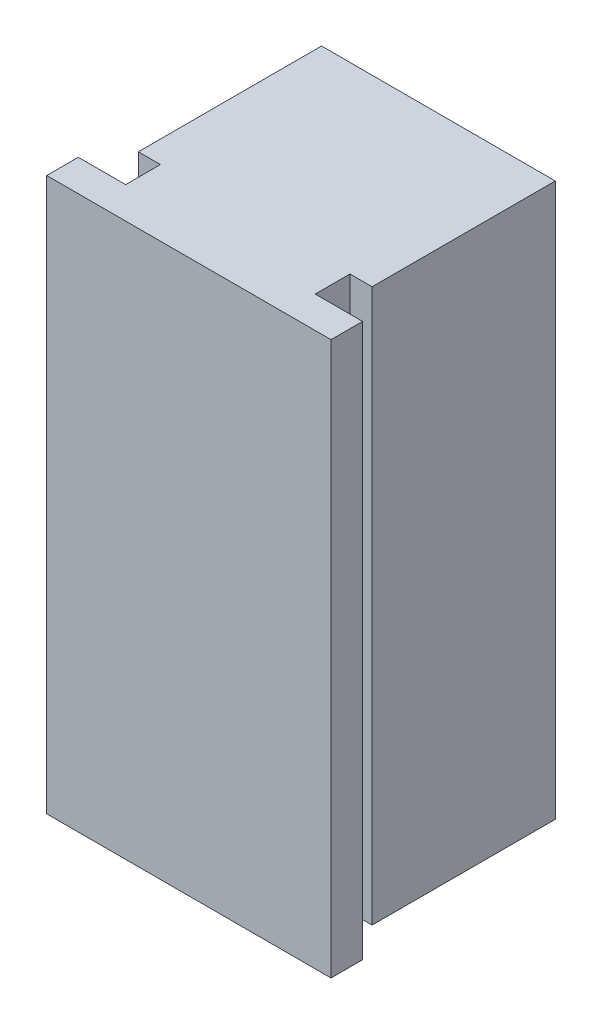
ISO-10303-21;
HEADER;
FILE_DESCRIPTION(('STEP AP214'),'2;1');
FILE_NAME('part.step','',(''),(''),'','','');
FILE_SCHEMA(('AUTOMOTIVE_DESIGN { 1 0 10303 214 1 1 1 1 }'));
ENDSEC;
DATA;
#1=APPLICATION_CONTEXT('core data for automotive mechanical design processes');
#2=APPLICATION_PROTOCOL_DEFINITION('international standard','automotive_design',2000,#1);
#3=PRODUCT_CONTEXT('',#1,'mechanical');
#4=PRODUCT('Part','Part','',(#3));
#5=PRODUCT_RELATED_PRODUCT_CATEGORY('part','',(#4));
#6=PRODUCT_DEFINITION_FORMATION('','',#4);
#7=PRODUCT_DEFINITION_CONTEXT('part definition',#1,'design');
#8=PRODUCT_DEFINITION('design','',#6,#7);
#9=PRODUCT_DEFINITION_SHAPE('','',#8);
#10=(LENGTH_UNIT() NAMED_UNIT(*) SI_UNIT(.MILLI.,.METRE.));
#11=(NAMED_UNIT(*) PLANE_ANGLE_UNIT() SI_UNIT($,.RADIAN.));
#12=(NAMED_UNIT(*) SI_UNIT($,.STERADIAN.) SOLID_ANGLE_UNIT());
#13=UNCERTAINTY_MEASURE_WITH_UNIT(LENGTH_MEASURE(1.E-05),#10,'distance_accuracy_value','');
#14=(GEOMETRIC_REPRESENTATION_CONTEXT(3) GLOBAL_UNCERTAINTY_ASSIGNED_CONTEXT((#13)) GLOBAL_UNIT_ASSIGNED_CONTEXT((#10,
#11,#12)) REPRESENTATION_CONTEXT('',''));
#15=CARTESIAN_POINT('',(0.,0.,0.));
#16=DIRECTION('',(0.,0.,1.));
#17=DIRECTION('',(1.,0.,0.));
#18=AXIS2_PLACEMENT_3D('',#15,#16,#17);
#19=CARTESIAN_POINT('',(0.,35.,3.36129032258062));
#20=DIRECTION('',(0.,0.,-1.));
#21=DIRECTION('',(-1.,0.,0.));
#22=AXIS2_PLACEMENT_3D('',#19,#20,#21);
#23=PLANE('',#22);
#24=CARTESIAN_POINT('',(8.9354838709677,17.5,3.36129032258062));
#25=DIRECTION('',(0.,0.,-1.));
#26=DIRECTION('',(-1.,0.,0.));
#27=AXIS2_PLACEMENT_3D('',#24,#25,#26);
#28=CIRCLE('',#27,4.5);
#29=CARTESIAN_POINT('',(4.4354838709677,17.5,3.36129032258062));
#30=VERTEX_POINT('',#29);
#31=EDGE_CURVE('E253',#30,#30,#28,.T.);
#32=ORIENTED_EDGE('',*,*,#31,.F.);
#33=EDGE_LOOP('',(#32));
#34=FACE_BOUND('',#33,.T.);
#35=DIRECTION('',(1.,0.,0.));
#36=VECTOR('',#35,1.);
#37=CARTESIAN_POINT('',(0.,0.,3.36129032258062));
#38=LINE('',#37,#36);
#39=CARTESIAN_POINT('',(1.5354838709677,0.,3.36129032258062));
#40=VERTEX_POINT('',#39);
#41=CARTESIAN_POINT('',(16.3354838709677,0.,3.36129032258061));
#42=VERTEX_POINT('',#41);
#43=EDGE_CURVE('E161',#40,#42,#38,.T.);
#44=ORIENTED_EDGE('',*,*,#43,.F.);
#45=DIRECTION('',(0.,-1.,0.));
#46=VECTOR('',#45,1.);
#47=CARTESIAN_POINT('',(1.5354838709677,35.,3.36129032258062));
#48=LINE('',#47,#46);
#49=CARTESIAN_POINT('',(1.5354838709677,35.,3.36129032258062));
#50=VERTEX_POINT('',#49);
#51=EDGE_CURVE('E11',#50,#40,#48,.T.);
#52=ORIENTED_EDGE('',*,*,#51,.F.);
#53=DIRECTION('',(1.,0.,0.));
#54=VECTOR('',#53,1.);
#55=CARTESIAN_POINT('',(0.,35.,3.36129032258062));
#56=LINE('',#55,#54);
#57=CARTESIAN_POINT('',(16.3354838709677,35.,3.36129032258061));
#58=VERTEX_POINT('',#57);
#59=EDGE_CURVE('E204',#50,#58,#56,.T.);
#60=ORIENTED_EDGE('',*,*,#59,.T.);
#61=DIRECTION('',(0.,-1.,0.));
#62=VECTOR('',#61,1.);
#63=CARTESIAN_POINT('',(16.3354838709677,35.,3.36129032258061));
#64=LINE('',#63,#62);
#65=EDGE_CURVE('E105',#58,#42,#64,.T.);
#66=ORIENTED_EDGE('',*,*,#65,.T.);
#67=EDGE_LOOP('',(#44,#52,#60,#66));
#68=FACE_BOUND('',#67,.T.);
#69=ADVANCED_FACE('F41',(#34,#68),#23,.T.);
#70=CARTESIAN_POINT('',(1.5354838709677,35.,0.));
#71=DIRECTION('',(-1.,0.,0.));
#72=DIRECTION('',(0.,0.,1.));
#73=AXIS2_PLACEMENT_3D('',#70,#71,#72);
#74=PLANE('',#73);
#75=DIRECTION('',(0.,0.,-1.));
#76=VECTOR('',#75,1.);
#77=CARTESIAN_POINT('',(1.5354838709677,0.,0.));
#78=LINE('',#77,#76);
#79=CARTESIAN_POINT('',(1.53548387096771,0.,14.9612903225806));
#80=VERTEX_POINT('',#79);
#81=EDGE_CURVE('E165',#80,#40,#78,.T.);
#82=ORIENTED_EDGE('',*,*,#81,.F.);
#83=DIRECTION('',(0.,-1.,0.));
#84=VECTOR('',#83,1.);
#85=CARTESIAN_POINT('',(1.53548387096771,35.,14.9612903225806));
#86=LINE('',#85,#84);
#87=CARTESIAN_POINT('',(1.53548387096771,35.,14.9612903225806));
#88=VERTEX_POINT('',#87);
#89=EDGE_CURVE('E50',#88,#80,#86,.T.);
#90=ORIENTED_EDGE('',*,*,#89,.F.);
#91=DIRECTION('',(0.,0.,-1.));
#92=VECTOR('',#91,1.);
#93=CARTESIAN_POINT('',(1.5354838709677,35.,0.));
#94=LINE('',#93,#92);
#95=EDGE_CURVE('E244',#88,#50,#94,.T.);
#96=ORIENTED_EDGE('',*,*,#95,.T.);
#97=ORIENTED_EDGE('',*,*,#51,.T.);
#98=EDGE_LOOP('',(#82,#90,#96,#97));
#99=FACE_BOUND('',#98,.T.);
#100=ADVANCED_FACE('F243',(#99),#74,.T.);
#101=CARTESIAN_POINT('',(0.,35.,14.9612903225806));
#102=DIRECTION('',(0.,0.,-1.));
#103=DIRECTION('',(-1.,0.,0.));
#104=AXIS2_PLACEMENT_3D('',#101,#102,#103);
#105=PLANE('',#104);
#106=DIRECTION('',(1.,0.,0.));
#107=VECTOR('',#106,1.);
#108=CARTESIAN_POINT('',(0.,0.,14.9612903225806));
#109=LINE('',#108,#107);
#110=CARTESIAN_POINT('',(2.9354838709677,0.,14.9612903225806));
#111=VERTEX_POINT('',#110);
#112=EDGE_CURVE('E170',#80,#111,#109,.T.);
#113=ORIENTED_EDGE('',*,*,#112,.T.);
#114=DIRECTION('',(0.,-1.,0.));
#115=VECTOR('',#114,1.);
#116=CARTESIAN_POINT('',(2.9354838709677,35.,14.9612903225806));
#117=LINE('',#116,#115);
#118=CARTESIAN_POINT('',(2.9354838709677,35.,14.9612903225806));
#119=VERTEX_POINT('',#118);
#120=EDGE_CURVE('E227',#119,#111,#117,.T.);
#121=ORIENTED_EDGE('',*,*,#120,.F.);
#122=DIRECTION('',(1.,0.,0.));
#123=VECTOR('',#122,1.);
#124=CARTESIAN_POINT('',(0.,35.,14.9612903225806));
#125=LINE('',#124,#123);
#126=EDGE_CURVE('E235',#88,#119,#125,.T.);
#127=ORIENTED_EDGE('',*,*,#126,.F.);
#128=ORIENTED_EDGE('',*,*,#89,.T.);
#129=EDGE_LOOP('',(#113,#121,#127,#128));
#130=FACE_BOUND('',#129,.T.);
#131=ADVANCED_FACE('F233',(#130),#105,.F.);
#132=CARTESIAN_POINT('',(2.93548387096768,35.,0.));
#133=DIRECTION('',(-1.,0.,0.));
#134=DIRECTION('',(0.,0.,1.));
#135=AXIS2_PLACEMENT_3D('',#132,#133,#134);
#136=PLANE('',#135);
#137=DIRECTION('',(0.,0.,-1.));
#138=VECTOR('',#137,1.);
#139=CARTESIAN_POINT('',(2.93548387096768,0.,0.));
#140=LINE('',#139,#138);
#141=CARTESIAN_POINT('',(2.93548387096771,0.,17.1612903225806));
#142=VERTEX_POINT('',#141);
#143=EDGE_CURVE('E174',#142,#111,#140,.T.);
#144=ORIENTED_EDGE('',*,*,#143,.F.);
#145=DIRECTION('',(0.,-1.,0.));
#146=VECTOR('',#145,1.);
#147=CARTESIAN_POINT('',(2.93548387096771,35.,17.1612903225806));
#148=LINE('',#147,#146);
#149=CARTESIAN_POINT('',(2.93548387096771,35.,17.1612903225806));
#150=VERTEX_POINT('',#149);
#151=EDGE_CURVE('E224',#150,#142,#148,.T.);
#152=ORIENTED_EDGE('',*,*,#151,.F.);
#153=DIRECTION('',(0.,0.,-1.));
#154=VECTOR('',#153,1.);
#155=CARTESIAN_POINT('',(2.93548387096768,35.,0.));
#156=LINE('',#155,#154);
#157=EDGE_CURVE('E258',#150,#119,#156,.T.);
#158=ORIENTED_EDGE('',*,*,#157,.T.);
#159=ORIENTED_EDGE('',*,*,#120,.T.);
#160=EDGE_LOOP('',(#144,#152,#158,#159));
#161=FACE_BOUND('',#160,.T.);
#162=ADVANCED_FACE('F299',(#161),#136,.T.);
#163=CARTESIAN_POINT('',(0.,35.,17.1612903225806));
#164=DIRECTION('',(0.,0.,-1.));
#165=DIRECTION('',(-1.,0.,0.));
#166=AXIS2_PLACEMENT_3D('',#163,#164,#165);
#167=PLANE('',#166);
#168=DIRECTION('',(1.,0.,0.));
#169=VECTOR('',#168,1.);
#170=CARTESIAN_POINT('',(0.,0.,17.1612903225806));
#171=LINE('',#170,#169);
#172=CARTESIAN_POINT('',(-0.0645161290322924,0.,17.1612903225806));
#173=VERTEX_POINT('',#172);
#174=EDGE_CURVE('E178',#173,#142,#171,.T.);
#175=ORIENTED_EDGE('',*,*,#174,.F.);
#176=DIRECTION('',(0.,-1.,0.));
#177=VECTOR('',#176,1.);
#178=CARTESIAN_POINT('',(-0.0645161290322924,35.,17.1612903225806));
#179=LINE('',#178,#177);
#180=CARTESIAN_POINT('',(-0.0645161290322924,35.,17.1612903225806));
#181=VERTEX_POINT('',#180);
#182=EDGE_CURVE('E221',#181,#173,#179,.T.);
#183=ORIENTED_EDGE('',*,*,#182,.F.);
#184=DIRECTION('',(1.,0.,0.));
#185=VECTOR('',#184,1.);
#186=CARTESIAN_POINT('',(0.,35.,17.1612903225806));
#187=LINE('',#186,#185);
#188=EDGE_CURVE('E262',#181,#150,#187,.T.);
#189=ORIENTED_EDGE('',*,*,#188,.T.);
#190=ORIENTED_EDGE('',*,*,#151,.T.);
#191=EDGE_LOOP('',(#175,#183,#189,#190));
#192=FACE_BOUND('',#191,.T.);
#193=ADVANCED_FACE('F295',(#192),#167,.T.);
#194=CARTESIAN_POINT('',(-0.0645161290322924,35.,0.));
#195=DIRECTION('',(-1.,0.,0.));
#196=DIRECTION('',(0.,0.,1.));
#197=AXIS2_PLACEMENT_3D('',#194,#195,#196);
#198=PLANE('',#197);
#199=DIRECTION('',(0.,0.,-1.));
#200=VECTOR('',#199,1.);
#201=CARTESIAN_POINT('',(-0.0645161290322924,0.,0.));
#202=LINE('',#201,#200);
#203=CARTESIAN_POINT('',(-0.0645161290322924,0.,19.1612903225806));
#204=VERTEX_POINT('',#203);
#205=EDGE_CURVE('E182',#204,#173,#202,.T.);
#206=ORIENTED_EDGE('',*,*,#205,.F.);
#207=DIRECTION('',(0.,-1.,0.));
#208=VECTOR('',#207,1.);
#209=CARTESIAN_POINT('',(-0.0645161290322924,35.,19.1612903225806));
#210=LINE('',#209,#208);
#211=CARTESIAN_POINT('',(-0.0645161290322924,35.,19.1612903225806));
#212=VERTEX_POINT('',#211);
#213=EDGE_CURVE('E218',#212,#204,#210,.T.);
#214=ORIENTED_EDGE('',*,*,#213,.F.);
#215=DIRECTION('',(0.,0.,-1.));
#216=VECTOR('',#215,1.);
#217=CARTESIAN_POINT('',(-0.0645161290322924,35.,0.));
#218=LINE('',#217,#216);
#219=EDGE_CURVE('E266',#212,#181,#218,.T.);
#220=ORIENTED_EDGE('',*,*,#219,.T.);
#221=ORIENTED_EDGE('',*,*,#182,.T.);
#222=EDGE_LOOP('',(#206,#214,#220,#221));
#223=FACE_BOUND('',#222,.T.);
#224=ADVANCED_FACE('F292',(#223),#198,.T.);
#225=CARTESIAN_POINT('',(0.,35.,19.1612903225806));
#226=DIRECTION('',(0.,0.,-1.));
#227=DIRECTION('',(-1.,0.,0.));
#228=AXIS2_PLACEMENT_3D('',#225,#226,#227);
#229=PLANE('',#228);
#230=DIRECTION('',(1.,0.,0.));
#231=VECTOR('',#230,1.);
#232=CARTESIAN_POINT('',(0.,0.,19.1612903225806));
#233=LINE('',#232,#231);
#234=CARTESIAN_POINT('',(17.9354838709677,0.,19.1612903225806));
#235=VERTEX_POINT('',#234);
#236=EDGE_CURVE('E186',#204,#235,#233,.T.);
#237=ORIENTED_EDGE('',*,*,#236,.T.);
#238=DIRECTION('',(0.,-1.,0.));
#239=VECTOR('',#238,1.);
#240=CARTESIAN_POINT('',(17.9354838709677,35.,19.1612903225806));
#241=LINE('',#240,#239);
#242=CARTESIAN_POINT('',(17.9354838709677,35.,19.1612903225806));
#243=VERTEX_POINT('',#242);
#244=EDGE_CURVE('E214',#243,#235,#241,.T.);
#245=ORIENTED_EDGE('',*,*,#244,.F.);
#246=DIRECTION('',(1.,0.,0.));
#247=VECTOR('',#246,1.);
#248=CARTESIAN_POINT('',(0.,35.,19.1612903225806));
#249=LINE('',#248,#247);
#250=EDGE_CURVE('E270',#212,#243,#249,.T.);
#251=ORIENTED_EDGE('',*,*,#250,.F.);
#252=ORIENTED_EDGE('',*,*,#213,.T.);
#253=EDGE_LOOP('',(#237,#245,#251,#252));
#254=FACE_BOUND('',#253,.T.);
#255=ADVANCED_FACE('F289',(#254),#229,.F.);
#256=CARTESIAN_POINT('',(17.9354838709677,35.,0.));
#257=DIRECTION('',(-1.,0.,0.));
#258=DIRECTION('',(0.,0.,1.));
#259=AXIS2_PLACEMENT_3D('',#256,#257,#258);
#260=PLANE('',#259);
#261=DIRECTION('',(0.,0.,-1.));
#262=VECTOR('',#261,1.);
#263=CARTESIAN_POINT('',(17.9354838709677,0.,0.));
#264=LINE('',#263,#262);
#265=CARTESIAN_POINT('',(17.9354838709677,0.,17.1612903225806));
#266=VERTEX_POINT('',#265);
#267=EDGE_CURVE('E189',#235,#266,#264,.T.);
#268=ORIENTED_EDGE('',*,*,#267,.T.);
#269=DIRECTION('',(0.,-1.,0.));
#270=VECTOR('',#269,1.);
#271=CARTESIAN_POINT('',(17.9354838709677,35.,17.1612903225806));
#272=LINE('',#271,#270);
#273=CARTESIAN_POINT('',(17.9354838709677,35.,17.1612903225806));
#274=VERTEX_POINT('',#273);
#275=EDGE_CURVE('E211',#274,#266,#272,.T.);
#276=ORIENTED_EDGE('',*,*,#275,.F.);
#277=DIRECTION('',(0.,0.,-1.));
#278=VECTOR('',#277,1.);
#279=CARTESIAN_POINT('',(17.9354838709677,35.,0.));
#280=LINE('',#279,#278);
#281=EDGE_CURVE('E273',#243,#274,#280,.T.);
#282=ORIENTED_EDGE('',*,*,#281,.F.);
#283=ORIENTED_EDGE('',*,*,#244,.T.);
#284=EDGE_LOOP('',(#268,#276,#282,#283));
#285=FACE_BOUND('',#284,.T.);
#286=ADVANCED_FACE('F284',(#285),#260,.F.);
#287=CARTESIAN_POINT('',(0.,35.,17.1612903225806));
#288=DIRECTION('',(0.,0.,-1.));
#289=DIRECTION('',(-1.,0.,0.));
#290=AXIS2_PLACEMENT_3D('',#287,#288,#289);
#291=PLANE('',#290);
#292=DIRECTION('',(1.,0.,0.));
#293=VECTOR('',#292,1.);
#294=CARTESIAN_POINT('',(0.,0.,17.1612903225806));
#295=LINE('',#294,#293);
#296=CARTESIAN_POINT('',(14.9354838709677,0.,17.1612903225806));
#297=VERTEX_POINT('',#296);
#298=EDGE_CURVE('E193',#297,#266,#295,.T.);
#299=ORIENTED_EDGE('',*,*,#298,.F.);
#300=DIRECTION('',(0.,-1.,0.));
#301=VECTOR('',#300,1.);
#302=CARTESIAN_POINT('',(14.9354838709677,35.,17.1612903225806));
#303=LINE('',#302,#301);
#304=CARTESIAN_POINT('',(14.9354838709677,35.,17.1612903225806));
#305=VERTEX_POINT('',#304);
#306=EDGE_CURVE('E151',#305,#297,#303,.T.);
#307=ORIENTED_EDGE('',*,*,#306,.F.);
#308=DIRECTION('',(1.,0.,0.));
#309=VECTOR('',#308,1.);
#310=CARTESIAN_POINT('',(0.,35.,17.1612903225806));
#311=LINE('',#310,#309);
#312=EDGE_CURVE('E142',#305,#274,#311,.T.);
#313=ORIENTED_EDGE('',*,*,#312,.T.);
#314=ORIENTED_EDGE('',*,*,#275,.T.);
#315=EDGE_LOOP('',(#299,#307,#313,#314));
#316=FACE_BOUND('',#315,.T.);
#317=ADVANCED_FACE('F278',(#316),#291,.T.);
#318=CARTESIAN_POINT('',(14.9354838709677,35.,0.));
#319=DIRECTION('',(-1.,0.,0.));
#320=DIRECTION('',(0.,0.,1.));
#321=AXIS2_PLACEMENT_3D('',#318,#319,#320);
#322=PLANE('',#321);
#323=DIRECTION('',(0.,0.,-1.));
#324=VECTOR('',#323,1.);
#325=CARTESIAN_POINT('',(14.9354838709677,0.,0.));
#326=LINE('',#325,#324);
#327=CARTESIAN_POINT('',(14.9354838709677,0.,14.9612903225806));
#328=VERTEX_POINT('',#327);
#329=EDGE_CURVE('E149',#297,#328,#326,.T.);
#330=ORIENTED_EDGE('',*,*,#329,.T.);
#331=DIRECTION('',(0.,-1.,0.));
#332=VECTOR('',#331,1.);
#333=CARTESIAN_POINT('',(14.9354838709677,35.,14.9612903225806));
#334=LINE('',#333,#332);
#335=CARTESIAN_POINT('',(14.9354838709677,35.,14.9612903225806));
#336=VERTEX_POINT('',#335);
#337=EDGE_CURVE('E146',#336,#328,#334,.T.);
#338=ORIENTED_EDGE('',*,*,#337,.F.);
#339=DIRECTION('',(0.,0.,-1.));
#340=VECTOR('',#339,1.);
#341=CARTESIAN_POINT('',(14.9354838709677,35.,0.));
#342=LINE('',#341,#340);
#343=EDGE_CURVE('E136',#305,#336,#342,.T.);
#344=ORIENTED_EDGE('',*,*,#343,.F.);
#345=ORIENTED_EDGE('',*,*,#306,.T.);
#346=EDGE_LOOP('',(#330,#338,#344,#345));
#347=FACE_BOUND('',#346,.T.);
#348=ADVANCED_FACE('F147',(#347),#322,.F.);
#349=CARTESIAN_POINT('',(0.,35.,14.9612903225806));
#350=DIRECTION('',(0.,0.,-1.));
#351=DIRECTION('',(-1.,0.,0.));
#352=AXIS2_PLACEMENT_3D('',#349,#350,#351);
#353=PLANE('',#352);
#354=DIRECTION('',(1.,0.,0.));
#355=VECTOR('',#354,1.);
#356=CARTESIAN_POINT('',(0.,0.,14.9612903225806));
#357=LINE('',#356,#355);
#358=CARTESIAN_POINT('',(16.3354838709677,0.,14.9612903225806));
#359=VERTEX_POINT('',#358);
#360=EDGE_CURVE('E98',#328,#359,#357,.T.);
#361=ORIENTED_EDGE('',*,*,#360,.T.);
#362=DIRECTION('',(0.,-1.,0.));
#363=VECTOR('',#362,1.);
#364=CARTESIAN_POINT('',(16.3354838709677,35.,14.9612903225806));
#365=LINE('',#364,#363);
#366=CARTESIAN_POINT('',(16.3354838709677,35.,14.9612903225806));
#367=VERTEX_POINT('',#366);
#368=EDGE_CURVE('E152',#367,#359,#365,.T.);
#369=ORIENTED_EDGE('',*,*,#368,.F.);
#370=DIRECTION('',(1.,0.,0.));
#371=VECTOR('',#370,1.);
#372=CARTESIAN_POINT('',(0.,35.,14.9612903225806));
#373=LINE('',#372,#371);
#374=EDGE_CURVE('E140',#336,#367,#373,.T.);
#375=ORIENTED_EDGE('',*,*,#374,.F.);
#376=ORIENTED_EDGE('',*,*,#337,.T.);
#377=EDGE_LOOP('',(#361,#369,#375,#376));
#378=FACE_BOUND('',#377,.T.);
#379=ADVANCED_FACE('F154',(#378),#353,.F.);
#380=CARTESIAN_POINT('',(16.3354838709677,35.,0.));
#381=DIRECTION('',(-1.,0.,0.));
#382=DIRECTION('',(0.,0.,1.));
#383=AXIS2_PLACEMENT_3D('',#380,#381,#382);
#384=PLANE('',#383);
#385=DIRECTION('',(0.,0.,-1.));
#386=VECTOR('',#385,1.);
#387=CARTESIAN_POINT('',(16.3354838709677,0.,0.));
#388=LINE('',#387,#386);
#389=EDGE_CURVE('E201',#359,#42,#388,.T.);
#390=ORIENTED_EDGE('',*,*,#389,.T.);
#391=ORIENTED_EDGE('',*,*,#65,.F.);
#392=DIRECTION('',(0.,0.,-1.));
#393=VECTOR('',#392,1.);
#394=CARTESIAN_POINT('',(16.3354838709677,35.,0.));
#395=LINE('',#394,#393);
#396=EDGE_CURVE('E58',#367,#58,#395,.T.);
#397=ORIENTED_EDGE('',*,*,#396,.F.);
#398=ORIENTED_EDGE('',*,*,#368,.T.);
#399=EDGE_LOOP('',(#390,#391,#397,#398));
#400=FACE_BOUND('',#399,.T.);
#401=ADVANCED_FACE('F247',(#400),#384,.F.);
#402=CARTESIAN_POINT('',(0.,35.,0.));
#403=DIRECTION('',(0.,1.,0.));
#404=DIRECTION('',(0.,0.,1.));
#405=AXIS2_PLACEMENT_3D('',#402,#403,#404);
#406=PLANE('',#405);
#407=ORIENTED_EDGE('',*,*,#59,.F.);
#408=ORIENTED_EDGE('',*,*,#95,.F.);
#409=ORIENTED_EDGE('',*,*,#126,.T.);
#410=ORIENTED_EDGE('',*,*,#157,.F.);
#411=ORIENTED_EDGE('',*,*,#188,.F.);
#412=ORIENTED_EDGE('',*,*,#219,.F.);
#413=ORIENTED_EDGE('',*,*,#250,.T.);
#414=ORIENTED_EDGE('',*,*,#281,.T.);
#415=ORIENTED_EDGE('',*,*,#312,.F.);
#416=ORIENTED_EDGE('',*,*,#343,.T.);
#417=ORIENTED_EDGE('',*,*,#374,.T.);
#418=ORIENTED_EDGE('',*,*,#396,.T.);
#419=EDGE_LOOP('',(#407,#408,#409,#410,#411,#412,#413,#414,#415,#416,#417,#418));
#420=FACE_BOUND('',#419,.T.);
#421=ADVANCED_FACE('F138',(#420),#406,.T.);
#422=CARTESIAN_POINT('',(0.,0.,0.));
#423=DIRECTION('',(0.,1.,0.));
#424=DIRECTION('',(0.,0.,1.));
#425=AXIS2_PLACEMENT_3D('',#422,#423,#424);
#426=PLANE('',#425);
#427=ORIENTED_EDGE('',*,*,#43,.T.);
#428=ORIENTED_EDGE('',*,*,#389,.F.);
#429=ORIENTED_EDGE('',*,*,#360,.F.);
#430=ORIENTED_EDGE('',*,*,#329,.F.);
#431=ORIENTED_EDGE('',*,*,#298,.T.);
#432=ORIENTED_EDGE('',*,*,#267,.F.);
#433=ORIENTED_EDGE('',*,*,#236,.F.);
#434=ORIENTED_EDGE('',*,*,#205,.T.);
#435=ORIENTED_EDGE('',*,*,#174,.T.);
#436=ORIENTED_EDGE('',*,*,#143,.T.);
#437=ORIENTED_EDGE('',*,*,#112,.F.);
#438=ORIENTED_EDGE('',*,*,#81,.T.);
#439=EDGE_LOOP('',(#427,#428,#429,#430,#431,#432,#433,#434,#435,#436,#437,#438));
#440=FACE_BOUND('',#439,.T.);
#441=ADVANCED_FACE('F241',(#440),#426,.F.);
#442=CARTESIAN_POINT('',(8.9354838709677,17.5,15.3612903225806));
#443=DIRECTION('',(0.,0.,-1.));
#444=DIRECTION('',(-1.,0.,0.));
#445=AXIS2_PLACEMENT_3D('',#442,#443,#444);
#446=CYLINDRICAL_SURFACE('',#445,4.5);
#447=CARTESIAN_POINT('',(8.9354838709677,17.5,15.3612903225806));
#448=DIRECTION('',(0.,0.,-1.));
#449=DIRECTION('',(-1.,0.,0.));
#450=AXIS2_PLACEMENT_3D('',#447,#448,#449);
#451=CIRCLE('',#450,4.5);
#452=CARTESIAN_POINT('',(4.4354838709677,17.5,15.3612903225806));
#453=VERTEX_POINT('',#452);
#454=EDGE_CURVE('E166',#453,#453,#451,.T.);
#455=ORIENTED_EDGE('',*,*,#454,.F.);
#456=EDGE_LOOP('',(#455));
#457=FACE_BOUND('',#456,.T.);
#458=ORIENTED_EDGE('',*,*,#31,.T.);
#459=EDGE_LOOP('',(#458));
#460=FACE_BOUND('',#459,.T.);
#461=ADVANCED_FACE('F323',(#457,#460),#446,.F.);
#462=CARTESIAN_POINT('',(8.9354838709677,17.5,15.3612903225806));
#463=DIRECTION('',(0.,0.,-1.));
#464=DIRECTION('',(-1.,0.,0.));
#465=AXIS2_PLACEMENT_3D('',#462,#463,#464);
#466=PLANE('',#465);
#467=ORIENTED_EDGE('',*,*,#454,.T.);
#468=EDGE_LOOP('',(#467));
#469=FACE_BOUND('',#468,.T.);
#470=ADVANCED_FACE('F321',(#469),#466,.T.);
#471=CLOSED_SHELL('',(#69,#100,#131,#162,#193,#224,#255,#286,#317,#348,#379,#401,#421,#441,#461,#470));
#472=MANIFOLD_SOLID_BREP('B2',#471);
#473=ADVANCED_BREP_SHAPE_REPRESENTATION('',(#18,#472),#14);
#474=SHAPE_DEFINITION_REPRESENTATION(#9,#473);
ENDSEC;
END-ISO-10303-21;
